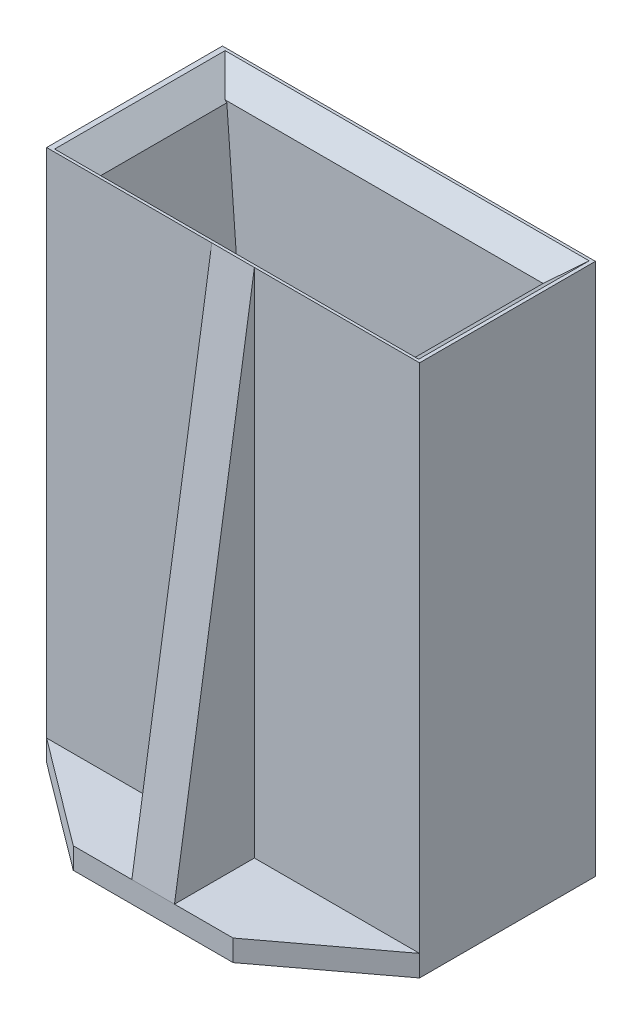
ISO-10303-21;
HEADER;
FILE_DESCRIPTION(('STEP AP214'),'2;1');
FILE_NAME('part.step','',(''),(''),'','','');
FILE_SCHEMA(('AUTOMOTIVE_DESIGN { 1 0 10303 214 1 1 1 1 }'));
ENDSEC;
DATA;
#1=APPLICATION_CONTEXT('core data for automotive mechanical design processes');
#2=APPLICATION_PROTOCOL_DEFINITION('international standard','automotive_design',2000,#1);
#3=PRODUCT_CONTEXT('',#1,'mechanical');
#4=PRODUCT('Part','Part','',(#3));
#5=PRODUCT_RELATED_PRODUCT_CATEGORY('part','',(#4));
#6=PRODUCT_DEFINITION_FORMATION('','',#4);
#7=PRODUCT_DEFINITION_CONTEXT('part definition',#1,'design');
#8=PRODUCT_DEFINITION('design','',#6,#7);
#9=PRODUCT_DEFINITION_SHAPE('','',#8);
#10=(LENGTH_UNIT() NAMED_UNIT(*) SI_UNIT(.MILLI.,.METRE.));
#11=(NAMED_UNIT(*) PLANE_ANGLE_UNIT() SI_UNIT($,.RADIAN.));
#12=(NAMED_UNIT(*) SI_UNIT($,.STERADIAN.) SOLID_ANGLE_UNIT());
#13=UNCERTAINTY_MEASURE_WITH_UNIT(LENGTH_MEASURE(1.E-05),#10,'distance_accuracy_value','');
#14=(GEOMETRIC_REPRESENTATION_CONTEXT(3) GLOBAL_UNCERTAINTY_ASSIGNED_CONTEXT((#13)) GLOBAL_UNIT_ASSIGNED_CONTEXT((#10,
#11,#12)) REPRESENTATION_CONTEXT('',''));
#15=CARTESIAN_POINT('',(0.,0.,0.));
#16=DIRECTION('',(0.,0.,1.));
#17=DIRECTION('',(1.,0.,0.));
#18=AXIS2_PLACEMENT_3D('',#15,#16,#17);
#19=CARTESIAN_POINT('',(0.,0.,16.5));
#20=DIRECTION('',(0.,0.,-1.));
#21=DIRECTION('',(-1.,0.,0.));
#22=AXIS2_PLACEMENT_3D('',#19,#20,#21);
#23=PLANE('',#22);
#24=DIRECTION('',(0.,-1.,0.));
#25=VECTOR('',#24,1.);
#26=CARTESIAN_POINT('',(31.,4.,16.5));
#27=LINE('',#26,#25);
#28=CARTESIAN_POINT('',(31.,100.,16.5));
#29=VERTEX_POINT('',#28);
#30=CARTESIAN_POINT('',(31.,4.,16.5));
#31=VERTEX_POINT('',#30);
#32=EDGE_CURVE('E237',#29,#31,#27,.T.);
#33=ORIENTED_EDGE('',*,*,#32,.F.);
#34=DIRECTION('',(-1.,0.,0.));
#35=VECTOR('',#34,1.);
#36=CARTESIAN_POINT('',(0.,100.,16.5));
#37=LINE('',#36,#35);
#38=CARTESIAN_POINT('',(0.,100.,16.5));
#39=VERTEX_POINT('',#38);
#40=EDGE_CURVE('E390',#29,#39,#37,.T.);
#41=ORIENTED_EDGE('',*,*,#40,.T.);
#42=DIRECTION('',(0.,-1.,0.));
#43=VECTOR('',#42,1.);
#44=CARTESIAN_POINT('',(0.,0.,16.5));
#45=LINE('',#44,#43);
#46=CARTESIAN_POINT('',(0.,4.,16.5));
#47=VERTEX_POINT('',#46);
#48=EDGE_CURVE('E381',#39,#47,#45,.T.);
#49=ORIENTED_EDGE('',*,*,#48,.T.);
#50=DIRECTION('',(1.,0.,0.));
#51=VECTOR('',#50,1.);
#52=CARTESIAN_POINT('',(70.,4.,16.5));
#53=LINE('',#52,#51);
#54=EDGE_CURVE('E216',#47,#31,#53,.T.);
#55=ORIENTED_EDGE('',*,*,#54,.T.);
#56=EDGE_LOOP('',(#33,#41,#49,#55));
#57=FACE_BOUND('',#56,.T.);
#58=ADVANCED_FACE('F43',(#57),#23,.F.);
#59=CARTESIAN_POINT('',(0.,4.,0.));
#60=DIRECTION('',(0.,1.,0.));
#61=DIRECTION('',(0.,0.,1.));
#62=AXIS2_PLACEMENT_3D('',#59,#60,#61);
#63=PLANE('',#62);
#64=DIRECTION('',(-1.,0.,0.));
#65=VECTOR('',#64,1.);
#66=CARTESIAN_POINT('',(20.,4.,31.5));
#67=LINE('',#66,#65);
#68=CARTESIAN_POINT('',(31.,4.,31.5));
#69=VERTEX_POINT('',#68);
#70=CARTESIAN_POINT('',(20.,4.,31.5));
#71=VERTEX_POINT('',#70);
#72=EDGE_CURVE('E323',#69,#71,#67,.T.);
#73=ORIENTED_EDGE('',*,*,#72,.F.);
#74=DIRECTION('',(0.,0.,1.));
#75=VECTOR('',#74,1.);
#76=CARTESIAN_POINT('',(31.,4.,31.5));
#77=LINE('',#76,#75);
#78=EDGE_CURVE('E246',#31,#69,#77,.T.);
#79=ORIENTED_EDGE('',*,*,#78,.F.);
#80=ORIENTED_EDGE('',*,*,#54,.F.);
#81=DIRECTION('',(-0.8,0.,-0.6));
#82=VECTOR('',#81,1.);
#83=CARTESIAN_POINT('',(0.,4.,16.5));
#84=LINE('',#83,#82);
#85=EDGE_CURVE('E327',#71,#47,#84,.T.);
#86=ORIENTED_EDGE('',*,*,#85,.F.);
#87=EDGE_LOOP('',(#73,#79,#80,#86));
#88=FACE_BOUND('',#87,.T.);
#89=ADVANCED_FACE('F557',(#88),#63,.T.);
#90=CARTESIAN_POINT('',(0.,0.,-16.5));
#91=DIRECTION('',(0.,0.,-1.));
#92=DIRECTION('',(-1.,0.,0.));
#93=AXIS2_PLACEMENT_3D('',#90,#91,#92);
#94=PLANE('',#93);
#95=DIRECTION('',(-1.,0.,0.));
#96=VECTOR('',#95,1.);
#97=CARTESIAN_POINT('',(0.,100.,-16.5));
#98=LINE('',#97,#96);
#99=CARTESIAN_POINT('',(31.,100.,-16.5));
#100=VERTEX_POINT('',#99);
#101=CARTESIAN_POINT('',(0.,100.,-16.5));
#102=VERTEX_POINT('',#101);
#103=EDGE_CURVE('E402',#100,#102,#98,.T.);
#104=ORIENTED_EDGE('',*,*,#103,.F.);
#105=DIRECTION('',(0.,1.,0.));
#106=VECTOR('',#105,1.);
#107=CARTESIAN_POINT('',(31.,4.,-16.5));
#108=LINE('',#107,#106);
#109=CARTESIAN_POINT('',(31.,4.,-16.5));
#110=VERTEX_POINT('',#109);
#111=EDGE_CURVE('E250',#110,#100,#108,.T.);
#112=ORIENTED_EDGE('',*,*,#111,.F.);
#113=DIRECTION('',(-1.,0.,0.));
#114=VECTOR('',#113,1.);
#115=CARTESIAN_POINT('',(70.,4.,-16.5));
#116=LINE('',#115,#114);
#117=CARTESIAN_POINT('',(0.,4.,-16.5));
#118=VERTEX_POINT('',#117);
#119=EDGE_CURVE('E288',#110,#118,#116,.T.);
#120=ORIENTED_EDGE('',*,*,#119,.T.);
#121=DIRECTION('',(0.,-1.,0.));
#122=VECTOR('',#121,1.);
#123=CARTESIAN_POINT('',(0.,0.,-16.5));
#124=LINE('',#123,#122);
#125=EDGE_CURVE('E377',#102,#118,#124,.T.);
#126=ORIENTED_EDGE('',*,*,#125,.F.);
#127=EDGE_LOOP('',(#104,#112,#120,#126));
#128=FACE_BOUND('',#127,.T.);
#129=ADVANCED_FACE('F537',(#128),#94,.T.);
#130=CARTESIAN_POINT('',(0.,4.,0.));
#131=DIRECTION('',(0.,-1.,0.));
#132=DIRECTION('',(0.,0.,-1.));
#133=AXIS2_PLACEMENT_3D('',#130,#131,#132);
#134=PLANE('',#133);
#135=DIRECTION('',(0.,0.,1.));
#136=VECTOR('',#135,1.);
#137=CARTESIAN_POINT('',(31.,4.,-31.5));
#138=LINE('',#137,#136);
#139=CARTESIAN_POINT('',(31.,4.,-31.5));
#140=VERTEX_POINT('',#139);
#141=EDGE_CURVE('E258',#140,#110,#138,.T.);
#142=ORIENTED_EDGE('',*,*,#141,.F.);
#143=DIRECTION('',(1.,0.,0.));
#144=VECTOR('',#143,1.);
#145=CARTESIAN_POINT('',(20.,4.,-31.5));
#146=LINE('',#145,#144);
#147=CARTESIAN_POINT('',(20.,4.,-31.5));
#148=VERTEX_POINT('',#147);
#149=EDGE_CURVE('E279',#148,#140,#146,.T.);
#150=ORIENTED_EDGE('',*,*,#149,.F.);
#151=DIRECTION('',(0.8,0.,-0.6));
#152=VECTOR('',#151,1.);
#153=CARTESIAN_POINT('',(0.,4.,-16.5));
#154=LINE('',#153,#152);
#155=EDGE_CURVE('E293',#118,#148,#154,.T.);
#156=ORIENTED_EDGE('',*,*,#155,.F.);
#157=ORIENTED_EDGE('',*,*,#119,.F.);
#158=EDGE_LOOP('',(#142,#150,#156,#157));
#159=FACE_BOUND('',#158,.T.);
#160=ADVANCED_FACE('F527',(#159),#134,.F.);
#161=DIRECTION('',(0.,1.,0.));
#162=VECTOR('',#161,1.);
#163=CARTESIAN_POINT('',(39.,4.,-16.5));
#164=LINE('',#163,#162);
#165=CARTESIAN_POINT('',(39.,4.,-16.5));
#166=VERTEX_POINT('',#165);
#167=CARTESIAN_POINT('',(39.,100.,-16.5));
#168=VERTEX_POINT('',#167);
#169=EDGE_CURVE('E249',#166,#168,#164,.T.);
#170=ORIENTED_EDGE('',*,*,#169,.T.);
#171=CARTESIAN_POINT('',(70.,100.,-16.5));
#172=VERTEX_POINT('',#171);
#173=EDGE_CURVE('E386',#172,#168,#98,.T.);
#174=ORIENTED_EDGE('',*,*,#173,.F.);
#175=DIRECTION('',(0.,1.,0.));
#176=VECTOR('',#175,1.);
#177=CARTESIAN_POINT('',(70.,0.,-16.5));
#178=LINE('',#177,#176);
#179=CARTESIAN_POINT('',(70.,4.,-16.5));
#180=VERTEX_POINT('',#179);
#181=EDGE_CURVE('E397',#180,#172,#178,.T.);
#182=ORIENTED_EDGE('',*,*,#181,.F.);
#183=EDGE_CURVE('E289',#180,#166,#116,.T.);
#184=ORIENTED_EDGE('',*,*,#183,.T.);
#185=EDGE_LOOP('',(#170,#174,#182,#184));
#186=FACE_BOUND('',#185,.T.);
#187=ADVANCED_FACE('F512',(#186),#94,.T.);
#188=CARTESIAN_POINT('',(0.,0.,16.5));
#189=DIRECTION('',(0.,1.,0.));
#190=DIRECTION('',(0.,0.,1.));
#191=AXIS2_PLACEMENT_3D('',#188,#189,#190);
#192=PLANE('',#191);
#193=DIRECTION('',(0.,0.,-1.));
#194=VECTOR('',#193,1.);
#195=CARTESIAN_POINT('',(0.,0.,16.5));
#196=LINE('',#195,#194);
#197=CARTESIAN_POINT('',(0.,0.,16.5));
#198=VERTEX_POINT('',#197);
#199=CARTESIAN_POINT('',(0.,0.,-16.5));
#200=VERTEX_POINT('',#199);
#201=EDGE_CURVE('E417',#198,#200,#196,.T.);
#202=ORIENTED_EDGE('',*,*,#201,.T.);
#203=DIRECTION('',(0.8,0.,-0.6));
#204=VECTOR('',#203,1.);
#205=CARTESIAN_POINT('',(0.,0.,-16.5));
#206=LINE('',#205,#204);
#207=CARTESIAN_POINT('',(20.,0.,-31.5));
#208=VERTEX_POINT('',#207);
#209=EDGE_CURVE('E305',#200,#208,#206,.T.);
#210=ORIENTED_EDGE('',*,*,#209,.T.);
#211=DIRECTION('',(1.,0.,0.));
#212=VECTOR('',#211,1.);
#213=CARTESIAN_POINT('',(20.,0.,-31.5));
#214=LINE('',#213,#212);
#215=CARTESIAN_POINT('',(50.,0.,-31.5));
#216=VERTEX_POINT('',#215);
#217=EDGE_CURVE('E278',#208,#216,#214,.T.);
#218=ORIENTED_EDGE('',*,*,#217,.T.);
#219=DIRECTION('',(0.8,0.,0.6));
#220=VECTOR('',#219,1.);
#221=CARTESIAN_POINT('',(50.,0.,-31.5));
#222=LINE('',#221,#220);
#223=CARTESIAN_POINT('',(70.,0.,-16.5));
#224=VERTEX_POINT('',#223);
#225=EDGE_CURVE('E301',#216,#224,#222,.T.);
#226=ORIENTED_EDGE('',*,*,#225,.T.);
#227=DIRECTION('',(0.,0.,-1.));
#228=VECTOR('',#227,1.);
#229=CARTESIAN_POINT('',(70.,0.,16.5));
#230=LINE('',#229,#228);
#231=CARTESIAN_POINT('',(70.,0.,16.5));
#232=VERTEX_POINT('',#231);
#233=EDGE_CURVE('E413',#232,#224,#230,.T.);
#234=ORIENTED_EDGE('',*,*,#233,.F.);
#235=DIRECTION('',(-0.8,0.,0.6));
#236=VECTOR('',#235,1.);
#237=CARTESIAN_POINT('',(50.,0.,31.5));
#238=LINE('',#237,#236);
#239=CARTESIAN_POINT('',(50.,0.,31.5));
#240=VERTEX_POINT('',#239);
#241=EDGE_CURVE('E312',#232,#240,#238,.T.);
#242=ORIENTED_EDGE('',*,*,#241,.T.);
#243=DIRECTION('',(-1.,0.,0.));
#244=VECTOR('',#243,1.);
#245=CARTESIAN_POINT('',(20.,0.,31.5));
#246=LINE('',#245,#244);
#247=CARTESIAN_POINT('',(20.,0.,31.5));
#248=VERTEX_POINT('',#247);
#249=EDGE_CURVE('E335',#240,#248,#246,.T.);
#250=ORIENTED_EDGE('',*,*,#249,.T.);
#251=DIRECTION('',(-0.8,0.,-0.6));
#252=VECTOR('',#251,1.);
#253=CARTESIAN_POINT('',(0.,0.,16.5));
#254=LINE('',#253,#252);
#255=EDGE_CURVE('E217',#248,#198,#254,.T.);
#256=ORIENTED_EDGE('',*,*,#255,.T.);
#257=EDGE_LOOP('',(#202,#210,#218,#226,#234,#242,#250,#256));
#258=FACE_BOUND('',#257,.T.);
#259=DIRECTION('',(1.,0.,0.));
#260=VECTOR('',#259,1.);
#261=CARTESIAN_POINT('',(12.4887984767073,0.,-12.));
#262=LINE('',#261,#260);
#263=CARTESIAN_POINT('',(12.4887984767073,0.,-12.));
#264=VERTEX_POINT('',#263);
#265=CARTESIAN_POINT('',(57.5112015232928,0.,-12.));
#266=VERTEX_POINT('',#265);
#267=EDGE_CURVE('E354',#264,#266,#262,.T.);
#268=ORIENTED_EDGE('',*,*,#267,.F.);
#269=DIRECTION('',(0.,0.,1.));
#270=VECTOR('',#269,1.);
#271=CARTESIAN_POINT('',(12.4887984767073,0.,-12.));
#272=LINE('',#271,#270);
#273=CARTESIAN_POINT('',(12.4887984767073,0.,12.));
#274=VERTEX_POINT('',#273);
#275=EDGE_CURVE('E363',#264,#274,#272,.T.);
#276=ORIENTED_EDGE('',*,*,#275,.T.);
#277=DIRECTION('',(1.,0.,0.));
#278=VECTOR('',#277,1.);
#279=CARTESIAN_POINT('',(12.4887984767073,0.,12.));
#280=LINE('',#279,#278);
#281=CARTESIAN_POINT('',(57.5112015232928,0.,12.));
#282=VERTEX_POINT('',#281);
#283=EDGE_CURVE('E366',#274,#282,#280,.T.);
#284=ORIENTED_EDGE('',*,*,#283,.T.);
#285=DIRECTION('',(0.,0.,1.));
#286=VECTOR('',#285,1.);
#287=CARTESIAN_POINT('',(57.5112015232928,0.,-12.));
#288=LINE('',#287,#286);
#289=EDGE_CURVE('E373',#266,#282,#288,.T.);
#290=ORIENTED_EDGE('',*,*,#289,.F.);
#291=EDGE_LOOP('',(#268,#276,#284,#290));
#292=FACE_BOUND('',#291,.T.);
#293=ADVANCED_FACE('F520',(#258,#292),#192,.F.);
#294=CARTESIAN_POINT('',(0.,100.,16.5));
#295=DIRECTION('',(0.,-1.,0.));
#296=DIRECTION('',(0.,0.,-1.));
#297=AXIS2_PLACEMENT_3D('',#294,#295,#296);
#298=PLANE('',#297);
#299=DIRECTION('',(-1.,0.,0.));
#300=VECTOR('',#299,1.);
#301=CARTESIAN_POINT('',(0.,100.,16.));
#302=LINE('',#301,#300);
#303=CARTESIAN_POINT('',(69.3359081629129,100.,16.));
#304=VERTEX_POINT('',#303);
#305=CARTESIAN_POINT('',(0.999999999999994,100.,16.));
#306=VERTEX_POINT('',#305);
#307=EDGE_CURVE('E431',#304,#306,#302,.T.);
#308=ORIENTED_EDGE('',*,*,#307,.T.);
#309=DIRECTION('',(0.,0.,-1.));
#310=VECTOR('',#309,1.);
#311=CARTESIAN_POINT('',(0.999999999999994,100.,16.5));
#312=LINE('',#311,#310);
#313=CARTESIAN_POINT('',(0.999999999999994,100.,-16.));
#314=VERTEX_POINT('',#313);
#315=EDGE_CURVE('E434',#306,#314,#312,.T.);
#316=ORIENTED_EDGE('',*,*,#315,.T.);
#317=DIRECTION('',(1.,0.,0.));
#318=VECTOR('',#317,1.);
#319=CARTESIAN_POINT('',(65.,100.,-16.));
#320=LINE('',#319,#318);
#321=CARTESIAN_POINT('',(69.3359081629129,100.,-16.));
#322=VERTEX_POINT('',#321);
#323=EDGE_CURVE('E425',#314,#322,#320,.T.);
#324=ORIENTED_EDGE('',*,*,#323,.T.);
#325=DIRECTION('',(0.,0.,1.));
#326=VECTOR('',#325,1.);
#327=CARTESIAN_POINT('',(69.3359081629129,100.,16.5));
#328=LINE('',#327,#326);
#329=EDGE_CURVE('E428',#322,#304,#328,.T.);
#330=ORIENTED_EDGE('',*,*,#329,.T.);
#331=EDGE_LOOP('',(#308,#316,#324,#330));
#332=FACE_BOUND('',#331,.T.);
#333=ORIENTED_EDGE('',*,*,#173,.T.);
#334=DIRECTION('',(1.,0.,0.));
#335=VECTOR('',#334,1.);
#336=CARTESIAN_POINT('',(31.,100.,-16.5));
#337=LINE('',#336,#335);
#338=EDGE_CURVE('E274',#100,#168,#337,.T.);
#339=ORIENTED_EDGE('',*,*,#338,.F.);
#340=ORIENTED_EDGE('',*,*,#103,.T.);
#341=DIRECTION('',(0.,0.,-1.));
#342=VECTOR('',#341,1.);
#343=CARTESIAN_POINT('',(0.,100.,16.5));
#344=LINE('',#343,#342);
#345=EDGE_CURVE('E393',#39,#102,#344,.T.);
#346=ORIENTED_EDGE('',*,*,#345,.F.);
#347=ORIENTED_EDGE('',*,*,#40,.F.);
#348=DIRECTION('',(1.,0.,0.));
#349=VECTOR('',#348,1.);
#350=CARTESIAN_POINT('',(31.,100.,16.5));
#351=LINE('',#350,#349);
#352=CARTESIAN_POINT('',(39.,100.,16.5));
#353=VERTEX_POINT('',#352);
#354=EDGE_CURVE('E245',#29,#353,#351,.T.);
#355=ORIENTED_EDGE('',*,*,#354,.T.);
#356=CARTESIAN_POINT('',(70.,100.,16.5));
#357=VERTEX_POINT('',#356);
#358=EDGE_CURVE('E224',#357,#353,#37,.T.);
#359=ORIENTED_EDGE('',*,*,#358,.F.);
#360=DIRECTION('',(0.,0.,-1.));
#361=VECTOR('',#360,1.);
#362=CARTESIAN_POINT('',(70.,100.,16.5));
#363=LINE('',#362,#361);
#364=EDGE_CURVE('E409',#357,#172,#363,.T.);
#365=ORIENTED_EDGE('',*,*,#364,.T.);
#366=EDGE_LOOP('',(#333,#339,#340,#346,#347,#355,#359,#365));
#367=FACE_BOUND('',#366,.T.);
#368=ADVANCED_FACE('F488',(#332,#367),#298,.F.);
#369=CARTESIAN_POINT('',(0.,0.,16.5));
#370=DIRECTION('',(1.,0.,0.));
#371=DIRECTION('',(0.,0.,-1.));
#372=AXIS2_PLACEMENT_3D('',#369,#370,#371);
#373=PLANE('',#372);
#374=ORIENTED_EDGE('',*,*,#125,.T.);
#375=DIRECTION('',(0.,-1.,0.));
#376=VECTOR('',#375,1.);
#377=CARTESIAN_POINT('',(0.,4.,-16.5));
#378=LINE('',#377,#376);
#379=EDGE_CURVE('E313',#118,#200,#378,.T.);
#380=ORIENTED_EDGE('',*,*,#379,.T.);
#381=ORIENTED_EDGE('',*,*,#201,.F.);
#382=DIRECTION('',(0.,-1.,0.));
#383=VECTOR('',#382,1.);
#384=CARTESIAN_POINT('',(0.,4.,16.5));
#385=LINE('',#384,#383);
#386=EDGE_CURVE('E342',#47,#198,#385,.T.);
#387=ORIENTED_EDGE('',*,*,#386,.F.);
#388=ORIENTED_EDGE('',*,*,#48,.F.);
#389=ORIENTED_EDGE('',*,*,#345,.T.);
#390=EDGE_LOOP('',(#374,#380,#381,#387,#388,#389));
#391=FACE_BOUND('',#390,.T.);
#392=ADVANCED_FACE('F534',(#391),#373,.F.);
#393=CARTESIAN_POINT('',(70.,0.,16.5));
#394=DIRECTION('',(-1.,0.,0.));
#395=DIRECTION('',(0.,0.,1.));
#396=AXIS2_PLACEMENT_3D('',#393,#394,#395);
#397=PLANE('',#396);
#398=EDGE_CURVE('E398',#224,#180,#178,.T.);
#399=ORIENTED_EDGE('',*,*,#398,.T.);
#400=ORIENTED_EDGE('',*,*,#181,.T.);
#401=ORIENTED_EDGE('',*,*,#364,.F.);
#402=DIRECTION('',(0.,1.,0.));
#403=VECTOR('',#402,1.);
#404=CARTESIAN_POINT('',(70.,0.,16.5));
#405=LINE('',#404,#403);
#406=CARTESIAN_POINT('',(70.,4.,16.5));
#407=VERTEX_POINT('',#406);
#408=EDGE_CURVE('E385',#407,#357,#405,.T.);
#409=ORIENTED_EDGE('',*,*,#408,.F.);
#410=EDGE_CURVE('E387',#232,#407,#405,.T.);
#411=ORIENTED_EDGE('',*,*,#410,.F.);
#412=ORIENTED_EDGE('',*,*,#233,.T.);
#413=EDGE_LOOP('',(#399,#400,#401,#409,#411,#412));
#414=FACE_BOUND('',#413,.T.);
#415=ADVANCED_FACE('F516',(#414),#397,.F.);
#416=ORIENTED_EDGE('',*,*,#358,.T.);
#417=DIRECTION('',(0.,-1.,0.));
#418=VECTOR('',#417,1.);
#419=CARTESIAN_POINT('',(39.,4.,16.5));
#420=LINE('',#419,#418);
#421=CARTESIAN_POINT('',(39.,4.,16.5));
#422=VERTEX_POINT('',#421);
#423=EDGE_CURVE('E221',#353,#422,#420,.T.);
#424=ORIENTED_EDGE('',*,*,#423,.T.);
#425=EDGE_CURVE('E204',#422,#407,#53,.T.);
#426=ORIENTED_EDGE('',*,*,#425,.T.);
#427=ORIENTED_EDGE('',*,*,#408,.T.);
#428=EDGE_LOOP('',(#416,#424,#426,#427));
#429=FACE_BOUND('',#428,.T.);
#430=ADVANCED_FACE('F222',(#429),#23,.F.);
#431=CARTESIAN_POINT('',(4.99999999999999,100.,-12.));
#432=DIRECTION('',(-0.997207634524542,-0.0746788701438824,0.));
#433=DIRECTION('',(0.0746788701438824,-0.997207634524542,0.));
#434=AXIS2_PLACEMENT_3D('',#431,#432,#433);
#435=PLANE('',#434);
#436=DIRECTION('',(0.0746788701438824,-0.997207634524542,0.));
#437=VECTOR('',#436,1.);
#438=CARTESIAN_POINT('',(4.99999999999999,100.,-12.));
#439=LINE('',#438,#437);
#440=CARTESIAN_POINT('',(5.32380072265396,95.6761992773461,-12.));
#441=VERTEX_POINT('',#440);
#442=EDGE_CURVE('E351',#441,#264,#439,.T.);
#443=ORIENTED_EDGE('',*,*,#442,.F.);
#444=DIRECTION('',(0.,0.,1.));
#445=VECTOR('',#444,1.);
#446=CARTESIAN_POINT('',(5.32380072265396,95.6761992773461,-12.));
#447=LINE('',#446,#445);
#448=CARTESIAN_POINT('',(5.32380072265396,95.6761992773461,12.));
#449=VERTEX_POINT('',#448);
#450=EDGE_CURVE('E421',#441,#449,#447,.T.);
#451=ORIENTED_EDGE('',*,*,#450,.T.);
#452=DIRECTION('',(0.0746788701438824,-0.997207634524542,0.));
#453=VECTOR('',#452,1.);
#454=CARTESIAN_POINT('',(4.99999999999999,100.,12.));
#455=LINE('',#454,#453);
#456=EDGE_CURVE('E345',#449,#274,#455,.T.);
#457=ORIENTED_EDGE('',*,*,#456,.T.);
#458=ORIENTED_EDGE('',*,*,#275,.F.);
#459=EDGE_LOOP('',(#443,#451,#457,#458));
#460=FACE_BOUND('',#459,.T.);
#461=ADVANCED_FACE('F567',(#460),#435,.F.);
#462=CARTESIAN_POINT('',(57.5112015232928,0.,-12.));
#463=DIRECTION('',(0.997207634524542,-0.0746788701438824,0.));
#464=DIRECTION('',(0.0746788701438824,0.997207634524542,0.));
#465=AXIS2_PLACEMENT_3D('',#462,#463,#464);
#466=PLANE('',#465);
#467=DIRECTION('',(-0.0528797136214822,-0.706117460443839,-0.706117460443837));
#468=VECTOR('',#467,1.);
#469=CARTESIAN_POINT('',(60.1996303378734,35.899334491943,-48.1006655080568));
#470=LINE('',#469,#468);
#471=CARTESIAN_POINT('',(64.7004480609317,96.,12.));
#472=VERTEX_POINT('',#471);
#473=CARTESIAN_POINT('',(64.7012845194245,96.0111694619018,12.0111694619018));
#474=VERTEX_POINT('',#473);
#475=EDGE_CURVE('E54',#472,#474,#470,.F.);
#476=ORIENTED_EDGE('',*,*,#475,.T.);
#477=DIRECTION('',(0.,0.,-1.));
#478=VECTOR('',#477,1.);
#479=CARTESIAN_POINT('',(64.7012845194245,96.0111694619018,-12.));
#480=LINE('',#479,#478);
#481=CARTESIAN_POINT('',(64.7012845194245,96.0111694619018,-12.0111694619018));
#482=VERTEX_POINT('',#481);
#483=EDGE_CURVE('E61',#474,#482,#480,.T.);
#484=ORIENTED_EDGE('',*,*,#483,.T.);
#485=DIRECTION('',(-0.0528797136214821,-0.706117460443837,0.706117460443839));
#486=VECTOR('',#485,1.);
#487=CARTESIAN_POINT('',(61.095773276067,47.865779322591,36.1342206774091));
#488=LINE('',#487,#486);
#489=CARTESIAN_POINT('',(64.7004480609317,96.,-12.));
#490=VERTEX_POINT('',#489);
#491=EDGE_CURVE('E11',#482,#490,#488,.T.);
#492=ORIENTED_EDGE('',*,*,#491,.T.);
#493=DIRECTION('',(0.0746788701438824,0.997207634524542,0.));
#494=VECTOR('',#493,1.);
#495=CARTESIAN_POINT('',(57.5112015232928,0.,-12.));
#496=LINE('',#495,#494);
#497=EDGE_CURVE('E359',#266,#490,#496,.T.);
#498=ORIENTED_EDGE('',*,*,#497,.F.);
#499=ORIENTED_EDGE('',*,*,#289,.T.);
#500=DIRECTION('',(0.0746788701438824,0.997207634524542,0.));
#501=VECTOR('',#500,1.);
#502=CARTESIAN_POINT('',(57.5112015232928,0.,12.));
#503=LINE('',#502,#501);
#504=EDGE_CURVE('E355',#282,#472,#503,.T.);
#505=ORIENTED_EDGE('',*,*,#504,.T.);
#506=EDGE_LOOP('',(#476,#484,#492,#498,#499,#505));
#507=FACE_BOUND('',#506,.T.);
#508=ADVANCED_FACE('F572',(#507),#466,.F.);
#509=CARTESIAN_POINT('',(0.,0.,-12.));
#510=DIRECTION('',(0.,0.,1.));
#511=DIRECTION('',(1.,0.,0.));
#512=AXIS2_PLACEMENT_3D('',#509,#510,#511);
#513=PLANE('',#512);
#514=ORIENTED_EDGE('',*,*,#497,.T.);
#515=DIRECTION('',(-1.,0.,0.));
#516=VECTOR('',#515,1.);
#517=CARTESIAN_POINT('',(4.99999999999999,96.,-12.));
#518=LINE('',#517,#516);
#519=CARTESIAN_POINT('',(4.99999999999999,96.,-12.));
#520=VERTEX_POINT('',#519);
#521=EDGE_CURVE('E443',#490,#520,#518,.T.);
#522=ORIENTED_EDGE('',*,*,#521,.T.);
#523=DIRECTION('',(-0.707106781186549,0.707106781186547,0.));
#524=VECTOR('',#523,1.);
#525=CARTESIAN_POINT('',(5.32380072265396,95.6761992773461,-12.));
#526=LINE('',#525,#524);
#527=EDGE_CURVE('E450',#520,#441,#526,.F.);
#528=ORIENTED_EDGE('',*,*,#527,.T.);
#529=ORIENTED_EDGE('',*,*,#442,.T.);
#530=ORIENTED_EDGE('',*,*,#267,.T.);
#531=EDGE_LOOP('',(#514,#522,#528,#529,#530));
#532=FACE_BOUND('',#531,.T.);
#533=ADVANCED_FACE('F616',(#532),#513,.T.);
#534=CARTESIAN_POINT('',(0.,0.,12.));
#535=DIRECTION('',(0.,0.,1.));
#536=DIRECTION('',(1.,0.,0.));
#537=AXIS2_PLACEMENT_3D('',#534,#535,#536);
#538=PLANE('',#537);
#539=DIRECTION('',(0.707106781186549,-0.707106781186547,0.));
#540=VECTOR('',#539,1.);
#541=CARTESIAN_POINT('',(50.5,50.5000000000001,12.));
#542=LINE('',#541,#540);
#543=CARTESIAN_POINT('',(5.00000000000001,96.,12.));
#544=VERTEX_POINT('',#543);
#545=EDGE_CURVE('E446',#449,#544,#542,.F.);
#546=ORIENTED_EDGE('',*,*,#545,.T.);
#547=DIRECTION('',(1.,0.,0.));
#548=VECTOR('',#547,1.);
#549=CARTESIAN_POINT('',(0.,96.,12.));
#550=LINE('',#549,#548);
#551=EDGE_CURVE('E438',#544,#472,#550,.T.);
#552=ORIENTED_EDGE('',*,*,#551,.T.);
#553=ORIENTED_EDGE('',*,*,#504,.F.);
#554=ORIENTED_EDGE('',*,*,#283,.F.);
#555=ORIENTED_EDGE('',*,*,#456,.F.);
#556=EDGE_LOOP('',(#546,#552,#553,#554,#555));
#557=FACE_BOUND('',#556,.T.);
#558=ADVANCED_FACE('F624',(#557),#538,.F.);
#559=CARTESIAN_POINT('',(0.,4.,16.5));
#560=DIRECTION('',(-0.6,0.,0.8));
#561=DIRECTION('',(0.8,0.,0.6));
#562=AXIS2_PLACEMENT_3D('',#559,#560,#561);
#563=PLANE('',#562);
#564=ORIENTED_EDGE('',*,*,#255,.F.);
#565=DIRECTION('',(0.,-1.,0.));
#566=VECTOR('',#565,1.);
#567=CARTESIAN_POINT('',(20.,4.,31.5));
#568=LINE('',#567,#566);
#569=EDGE_CURVE('E346',#71,#248,#568,.T.);
#570=ORIENTED_EDGE('',*,*,#569,.F.);
#571=ORIENTED_EDGE('',*,*,#85,.T.);
#572=ORIENTED_EDGE('',*,*,#386,.T.);
#573=EDGE_LOOP('',(#564,#570,#571,#572));
#574=FACE_BOUND('',#573,.T.);
#575=ADVANCED_FACE('F626',(#574),#563,.T.);
#576=CARTESIAN_POINT('',(20.,4.,31.5));
#577=DIRECTION('',(0.,0.,1.));
#578=DIRECTION('',(1.,0.,0.));
#579=AXIS2_PLACEMENT_3D('',#576,#577,#578);
#580=PLANE('',#579);
#581=ORIENTED_EDGE('',*,*,#249,.F.);
#582=DIRECTION('',(0.,-1.,0.));
#583=VECTOR('',#582,1.);
#584=CARTESIAN_POINT('',(50.,4.,31.5));
#585=LINE('',#584,#583);
#586=CARTESIAN_POINT('',(50.,4.,31.5));
#587=VERTEX_POINT('',#586);
#588=EDGE_CURVE('E331',#587,#240,#585,.T.);
#589=ORIENTED_EDGE('',*,*,#588,.F.);
#590=CARTESIAN_POINT('',(39.,4.,31.5));
#591=VERTEX_POINT('',#590);
#592=EDGE_CURVE('E324',#587,#591,#67,.T.);
#593=ORIENTED_EDGE('',*,*,#592,.T.);
#594=DIRECTION('',(1.,0.,0.));
#595=VECTOR('',#594,1.);
#596=CARTESIAN_POINT('',(31.,4.,31.5));
#597=LINE('',#596,#595);
#598=EDGE_CURVE('E241',#69,#591,#597,.T.);
#599=ORIENTED_EDGE('',*,*,#598,.F.);
#600=ORIENTED_EDGE('',*,*,#72,.T.);
#601=ORIENTED_EDGE('',*,*,#569,.T.);
#602=EDGE_LOOP('',(#581,#589,#593,#599,#600,#601));
#603=FACE_BOUND('',#602,.T.);
#604=ADVANCED_FACE('F632',(#603),#580,.T.);
#605=CARTESIAN_POINT('',(50.,4.,31.5));
#606=DIRECTION('',(0.6,0.,0.8));
#607=DIRECTION('',(0.8,0.,-0.6));
#608=AXIS2_PLACEMENT_3D('',#605,#606,#607);
#609=PLANE('',#608);
#610=ORIENTED_EDGE('',*,*,#241,.F.);
#611=ORIENTED_EDGE('',*,*,#410,.T.);
#612=DIRECTION('',(-0.8,0.,0.6));
#613=VECTOR('',#612,1.);
#614=CARTESIAN_POINT('',(50.,4.,31.5));
#615=LINE('',#614,#613);
#616=EDGE_CURVE('E212',#407,#587,#615,.T.);
#617=ORIENTED_EDGE('',*,*,#616,.T.);
#618=ORIENTED_EDGE('',*,*,#588,.T.);
#619=EDGE_LOOP('',(#610,#611,#617,#618));
#620=FACE_BOUND('',#619,.T.);
#621=ADVANCED_FACE('F766',(#620),#609,.T.);
#622=DIRECTION('',(0.,0.,1.));
#623=VECTOR('',#622,1.);
#624=CARTESIAN_POINT('',(39.,4.,31.5));
#625=LINE('',#624,#623);
#626=EDGE_CURVE('E209',#422,#591,#625,.T.);
#627=ORIENTED_EDGE('',*,*,#626,.T.);
#628=ORIENTED_EDGE('',*,*,#592,.F.);
#629=ORIENTED_EDGE('',*,*,#616,.F.);
#630=ORIENTED_EDGE('',*,*,#425,.F.);
#631=EDGE_LOOP('',(#627,#628,#629,#630));
#632=FACE_BOUND('',#631,.T.);
#633=ADVANCED_FACE('F206',(#632),#63,.T.);
#634=CARTESIAN_POINT('',(20.,4.,-31.5));
#635=DIRECTION('',(0.,0.,-1.));
#636=DIRECTION('',(-1.,0.,0.));
#637=AXIS2_PLACEMENT_3D('',#634,#635,#636);
#638=PLANE('',#637);
#639=ORIENTED_EDGE('',*,*,#217,.F.);
#640=DIRECTION('',(0.,-1.,0.));
#641=VECTOR('',#640,1.);
#642=CARTESIAN_POINT('',(20.,4.,-31.5));
#643=LINE('',#642,#641);
#644=EDGE_CURVE('E309',#148,#208,#643,.T.);
#645=ORIENTED_EDGE('',*,*,#644,.F.);
#646=ORIENTED_EDGE('',*,*,#149,.T.);
#647=DIRECTION('',(1.,0.,0.));
#648=VECTOR('',#647,1.);
#649=CARTESIAN_POINT('',(31.,4.,-31.5));
#650=LINE('',#649,#648);
#651=CARTESIAN_POINT('',(39.,4.,-31.5));
#652=VERTEX_POINT('',#651);
#653=EDGE_CURVE('E261',#140,#652,#650,.T.);
#654=ORIENTED_EDGE('',*,*,#653,.T.);
#655=CARTESIAN_POINT('',(50.,4.,-31.5));
#656=VERTEX_POINT('',#655);
#657=EDGE_CURVE('E284',#652,#656,#146,.T.);
#658=ORIENTED_EDGE('',*,*,#657,.T.);
#659=DIRECTION('',(0.,-1.,0.));
#660=VECTOR('',#659,1.);
#661=CARTESIAN_POINT('',(50.,4.,-31.5));
#662=LINE('',#661,#660);
#663=EDGE_CURVE('E297',#656,#216,#662,.T.);
#664=ORIENTED_EDGE('',*,*,#663,.T.);
#665=EDGE_LOOP('',(#639,#645,#646,#654,#658,#664));
#666=FACE_BOUND('',#665,.T.);
#667=ADVANCED_FACE('F501',(#666),#638,.T.);
#668=CARTESIAN_POINT('',(0.,4.,-16.5));
#669=DIRECTION('',(-0.6,0.,-0.8));
#670=DIRECTION('',(-0.8,0.,0.6));
#671=AXIS2_PLACEMENT_3D('',#668,#669,#670);
#672=PLANE('',#671);
#673=ORIENTED_EDGE('',*,*,#209,.F.);
#674=ORIENTED_EDGE('',*,*,#379,.F.);
#675=ORIENTED_EDGE('',*,*,#155,.T.);
#676=ORIENTED_EDGE('',*,*,#644,.T.);
#677=EDGE_LOOP('',(#673,#674,#675,#676));
#678=FACE_BOUND('',#677,.T.);
#679=ADVANCED_FACE('F530',(#678),#672,.T.);
#680=CARTESIAN_POINT('',(50.,4.,-31.5));
#681=DIRECTION('',(0.6,0.,-0.8));
#682=DIRECTION('',(-0.8,0.,-0.6));
#683=AXIS2_PLACEMENT_3D('',#680,#681,#682);
#684=PLANE('',#683);
#685=ORIENTED_EDGE('',*,*,#225,.F.);
#686=ORIENTED_EDGE('',*,*,#663,.F.);
#687=DIRECTION('',(0.8,0.,0.6));
#688=VECTOR('',#687,1.);
#689=CARTESIAN_POINT('',(50.,4.,-31.5));
#690=LINE('',#689,#688);
#691=EDGE_CURVE('E283',#656,#180,#690,.T.);
#692=ORIENTED_EDGE('',*,*,#691,.T.);
#693=ORIENTED_EDGE('',*,*,#398,.F.);
#694=EDGE_LOOP('',(#685,#686,#692,#693));
#695=FACE_BOUND('',#694,.T.);
#696=ADVANCED_FACE('F507',(#695),#684,.T.);
#697=ORIENTED_EDGE('',*,*,#657,.F.);
#698=DIRECTION('',(0.,0.,1.));
#699=VECTOR('',#698,1.);
#700=CARTESIAN_POINT('',(39.,4.,-31.5));
#701=LINE('',#700,#699);
#702=EDGE_CURVE('E255',#652,#166,#701,.T.);
#703=ORIENTED_EDGE('',*,*,#702,.T.);
#704=ORIENTED_EDGE('',*,*,#183,.F.);
#705=ORIENTED_EDGE('',*,*,#691,.F.);
#706=EDGE_LOOP('',(#697,#703,#704,#705));
#707=FACE_BOUND('',#706,.T.);
#708=ADVANCED_FACE('F509',(#707),#134,.F.);
#709=CARTESIAN_POINT('',(31.,100.,-16.5));
#710=DIRECTION('',(0.,-0.15437688027361,0.988012033751101));
#711=DIRECTION('',(0.,-0.988012033751101,-0.15437688027361));
#712=AXIS2_PLACEMENT_3D('',#709,#710,#711);
#713=PLANE('',#712);
#714=DIRECTION('',(0.,-0.988012033751101,-0.15437688027361));
#715=VECTOR('',#714,1.);
#716=CARTESIAN_POINT('',(39.,100.,-16.5));
#717=LINE('',#716,#715);
#718=EDGE_CURVE('E265',#168,#652,#717,.T.);
#719=ORIENTED_EDGE('',*,*,#718,.T.);
#720=ORIENTED_EDGE('',*,*,#653,.F.);
#721=DIRECTION('',(0.,-0.988012033751101,-0.15437688027361));
#722=VECTOR('',#721,1.);
#723=CARTESIAN_POINT('',(31.,100.,-16.5));
#724=LINE('',#723,#722);
#725=EDGE_CURVE('E254',#100,#140,#724,.T.);
#726=ORIENTED_EDGE('',*,*,#725,.F.);
#727=ORIENTED_EDGE('',*,*,#338,.T.);
#728=EDGE_LOOP('',(#719,#720,#726,#727));
#729=FACE_BOUND('',#728,.T.);
#730=ADVANCED_FACE('F543',(#729),#713,.F.);
#731=CARTESIAN_POINT('',(31.,0.,0.));
#732=DIRECTION('',(1.,0.,0.));
#733=DIRECTION('',(0.,0.,-1.));
#734=AXIS2_PLACEMENT_3D('',#731,#732,#733);
#735=PLANE('',#734);
#736=ORIENTED_EDGE('',*,*,#111,.T.);
#737=ORIENTED_EDGE('',*,*,#725,.T.);
#738=ORIENTED_EDGE('',*,*,#141,.T.);
#739=EDGE_LOOP('',(#736,#737,#738));
#740=FACE_BOUND('',#739,.T.);
#741=ADVANCED_FACE('F541',(#740),#735,.F.);
#742=CARTESIAN_POINT('',(39.,0.,0.));
#743=DIRECTION('',(1.,0.,0.));
#744=DIRECTION('',(0.,0.,-1.));
#745=AXIS2_PLACEMENT_3D('',#742,#743,#744);
#746=PLANE('',#745);
#747=ORIENTED_EDGE('',*,*,#169,.F.);
#748=ORIENTED_EDGE('',*,*,#702,.F.);
#749=ORIENTED_EDGE('',*,*,#718,.F.);
#750=EDGE_LOOP('',(#747,#748,#749));
#751=FACE_BOUND('',#750,.T.);
#752=ADVANCED_FACE('F545',(#751),#746,.T.);
#753=CARTESIAN_POINT('',(31.,100.,16.5));
#754=DIRECTION('',(0.,-0.15437688027361,-0.988012033751101));
#755=DIRECTION('',(0.,0.988012033751101,-0.15437688027361));
#756=AXIS2_PLACEMENT_3D('',#753,#754,#755);
#757=PLANE('',#756);
#758=DIRECTION('',(0.,0.988012033751101,-0.15437688027361));
#759=VECTOR('',#758,1.);
#760=CARTESIAN_POINT('',(39.,100.,16.5));
#761=LINE('',#760,#759);
#762=EDGE_CURVE('E229',#591,#353,#761,.T.);
#763=ORIENTED_EDGE('',*,*,#762,.T.);
#764=ORIENTED_EDGE('',*,*,#354,.F.);
#765=DIRECTION('',(0.,0.988012033751101,-0.15437688027361));
#766=VECTOR('',#765,1.);
#767=CARTESIAN_POINT('',(31.,100.,16.5));
#768=LINE('',#767,#766);
#769=EDGE_CURVE('E233',#69,#29,#768,.T.);
#770=ORIENTED_EDGE('',*,*,#769,.F.);
#771=ORIENTED_EDGE('',*,*,#598,.T.);
#772=EDGE_LOOP('',(#763,#764,#770,#771));
#773=FACE_BOUND('',#772,.T.);
#774=ADVANCED_FACE('F547',(#773),#757,.F.);
#775=CARTESIAN_POINT('',(31.,0.,0.));
#776=DIRECTION('',(1.,0.,0.));
#777=DIRECTION('',(0.,0.,-1.));
#778=AXIS2_PLACEMENT_3D('',#775,#776,#777);
#779=PLANE('',#778);
#780=ORIENTED_EDGE('',*,*,#769,.T.);
#781=ORIENTED_EDGE('',*,*,#32,.T.);
#782=ORIENTED_EDGE('',*,*,#78,.T.);
#783=EDGE_LOOP('',(#780,#781,#782));
#784=FACE_BOUND('',#783,.T.);
#785=ADVANCED_FACE('F482',(#784),#779,.F.);
#786=CARTESIAN_POINT('',(39.,0.,0.));
#787=DIRECTION('',(1.,0.,0.));
#788=DIRECTION('',(0.,0.,-1.));
#789=AXIS2_PLACEMENT_3D('',#786,#787,#788);
#790=PLANE('',#789);
#791=ORIENTED_EDGE('',*,*,#762,.F.);
#792=ORIENTED_EDGE('',*,*,#626,.F.);
#793=ORIENTED_EDGE('',*,*,#423,.F.);
#794=EDGE_LOOP('',(#791,#792,#793));
#795=FACE_BOUND('',#794,.T.);
#796=ADVANCED_FACE('F231',(#795),#790,.T.);
#797=CARTESIAN_POINT('',(69.3359081629129,100.,16.5));
#798=DIRECTION('',(0.652326345133212,-0.757938216113389,0.));
#799=DIRECTION('',(0.,0.,1.));
#800=AXIS2_PLACEMENT_3D('',#797,#798,#799);
#801=PLANE('',#800);
#802=DIRECTION('',(0.63481280178768,0.546357349491374,0.546357349491372));
#803=VECTOR('',#802,1.);
#804=CARTESIAN_POINT('',(41.3944182029055,75.9519052665618,-8.0480947334381));
#805=LINE('',#804,#803);
#806=EDGE_CURVE('E461',#304,#474,#805,.F.);
#807=ORIENTED_EDGE('',*,*,#806,.F.);
#808=ORIENTED_EDGE('',*,*,#329,.F.);
#809=DIRECTION('',(-0.634812801787679,-0.546357349491373,0.546357349491374));
#810=VECTOR('',#809,1.);
#811=CARTESIAN_POINT('',(58.0637823691558,90.2985435163448,-6.29854351634472));
#812=LINE('',#811,#810);
#813=EDGE_CURVE('E48',#482,#322,#812,.F.);
#814=ORIENTED_EDGE('',*,*,#813,.F.);
#815=ORIENTED_EDGE('',*,*,#483,.F.);
#816=EDGE_LOOP('',(#807,#808,#814,#815));
#817=FACE_BOUND('',#816,.T.);
#818=ADVANCED_FACE('F46',(#817),#801,.F.);
#819=CARTESIAN_POINT('',(0.,96.,-12.));
#820=DIRECTION('',(0.,0.707106781186548,0.707106781186547));
#821=DIRECTION('',(1.,0.,0.));
#822=AXIS2_PLACEMENT_3D('',#819,#820,#821);
#823=PLANE('',#822);
#824=ORIENTED_EDGE('',*,*,#813,.T.);
#825=ORIENTED_EDGE('',*,*,#323,.F.);
#826=DIRECTION('',(-0.577350269189626,0.577350269189625,-0.577350269189626));
#827=VECTOR('',#826,1.);
#828=CARTESIAN_POINT('',(5.21586714843597,95.784132851564,-11.784132851564));
#829=LINE('',#828,#827);
#830=EDGE_CURVE('E459',#520,#314,#829,.T.);
#831=ORIENTED_EDGE('',*,*,#830,.F.);
#832=ORIENTED_EDGE('',*,*,#521,.F.);
#833=ORIENTED_EDGE('',*,*,#491,.F.);
#834=EDGE_LOOP('',(#824,#825,#831,#832,#833));
#835=FACE_BOUND('',#834,.T.);
#836=ADVANCED_FACE('F596',(#835),#823,.T.);
#837=CARTESIAN_POINT('',(0.,100.,16.));
#838=DIRECTION('',(0.,-0.707106781186546,0.707106781186549));
#839=DIRECTION('',(-1.,0.,0.));
#840=AXIS2_PLACEMENT_3D('',#837,#838,#839);
#841=PLANE('',#840);
#842=ORIENTED_EDGE('',*,*,#551,.F.);
#843=DIRECTION('',(-0.577350269189628,0.577350269189626,0.577350269189624));
#844=VECTOR('',#843,1.);
#845=CARTESIAN_POINT('',(13.215867148436,87.7841328515641,3.78413285156409));
#846=LINE('',#845,#844);
#847=EDGE_CURVE('E455',#306,#544,#846,.F.);
#848=ORIENTED_EDGE('',*,*,#847,.F.);
#849=ORIENTED_EDGE('',*,*,#307,.F.);
#850=ORIENTED_EDGE('',*,*,#806,.T.);
#851=ORIENTED_EDGE('',*,*,#475,.F.);
#852=EDGE_LOOP('',(#842,#848,#849,#850,#851));
#853=FACE_BOUND('',#852,.T.);
#854=ADVANCED_FACE('F590',(#853),#841,.F.);
#855=CARTESIAN_POINT('',(5.32380072265396,95.6761992773461,-12.));
#856=DIRECTION('',(-0.707106781186546,-0.707106781186548,0.));
#857=DIRECTION('',(0.,0.,1.));
#858=AXIS2_PLACEMENT_3D('',#855,#856,#857);
#859=PLANE('',#858);
#860=ORIENTED_EDGE('',*,*,#830,.T.);
#861=ORIENTED_EDGE('',*,*,#315,.F.);
#862=ORIENTED_EDGE('',*,*,#847,.T.);
#863=ORIENTED_EDGE('',*,*,#545,.F.);
#864=ORIENTED_EDGE('',*,*,#450,.F.);
#865=ORIENTED_EDGE('',*,*,#527,.F.);
#866=EDGE_LOOP('',(#860,#861,#862,#863,#864,#865));
#867=FACE_BOUND('',#866,.T.);
#868=ADVANCED_FACE('F584',(#867),#859,.F.);
#869=CLOSED_SHELL('',(#58,#89,#129,#160,#187,#293,#368,#392,#415,#430,#461,#508,#533,#558,#575,
#604,#621,#633,#667,#679,#696,#708,#730,#741,#752,#774,#785,#796,#818,#836,#854,#868));
#870=MANIFOLD_SOLID_BREP('B2',#869);
#871=ADVANCED_BREP_SHAPE_REPRESENTATION('',(#18,#870),#14);
#872=SHAPE_DEFINITION_REPRESENTATION(#9,#871);
ENDSEC;
END-ISO-10303-21;
